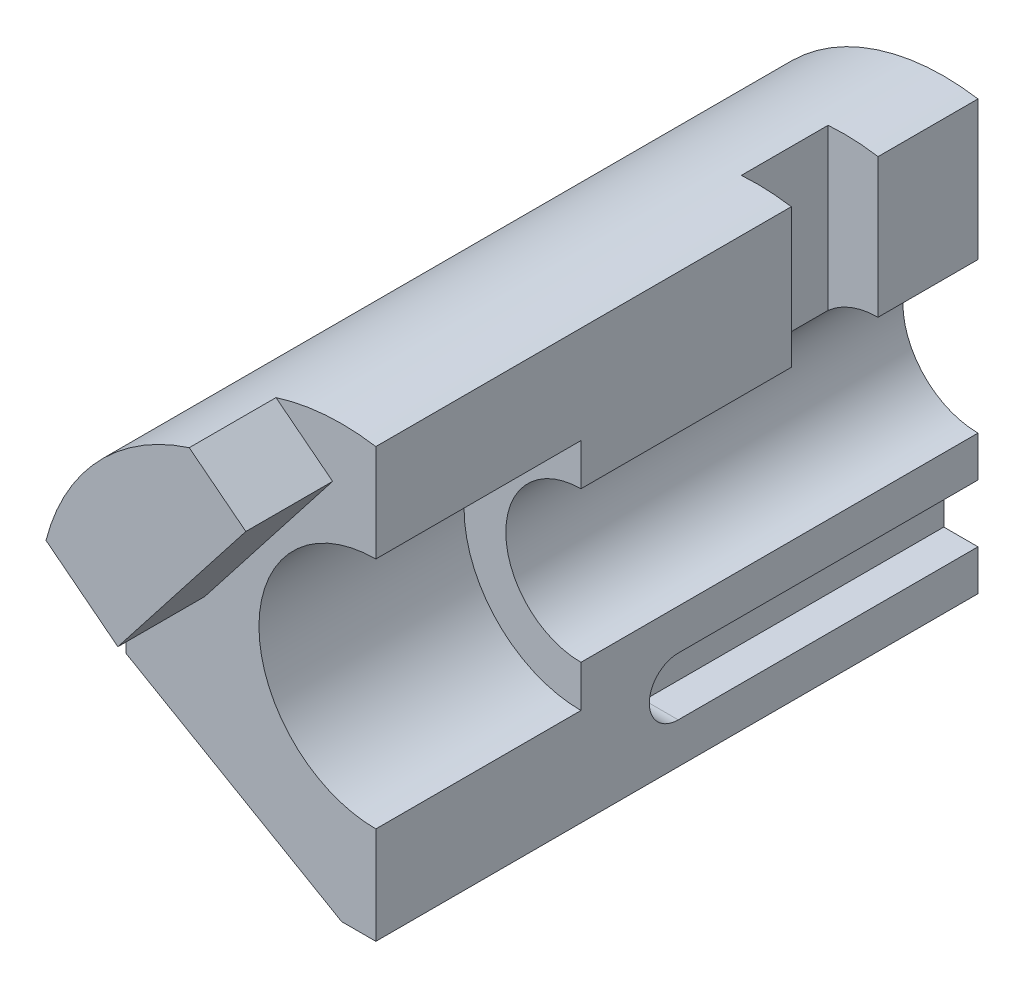
ISO-10303-21;
HEADER;
FILE_DESCRIPTION(('STEP AP214'),'2;1');
FILE_NAME('part.step','',(''),(''),'','','');
FILE_SCHEMA(('AUTOMOTIVE_DESIGN { 1 0 10303 214 1 1 1 1 }'));
ENDSEC;
DATA;
#1=APPLICATION_CONTEXT('core data for automotive mechanical design processes');
#2=APPLICATION_PROTOCOL_DEFINITION('international standard','automotive_design',2000,#1);
#3=PRODUCT_CONTEXT('',#1,'mechanical');
#4=PRODUCT('Part','Part','',(#3));
#5=PRODUCT_RELATED_PRODUCT_CATEGORY('part','',(#4));
#6=PRODUCT_DEFINITION_FORMATION('','',#4);
#7=PRODUCT_DEFINITION_CONTEXT('part definition',#1,'design');
#8=PRODUCT_DEFINITION('design','',#6,#7);
#9=PRODUCT_DEFINITION_SHAPE('','',#8);
#10=(LENGTH_UNIT() NAMED_UNIT(*) SI_UNIT(.MILLI.,.METRE.));
#11=(NAMED_UNIT(*) PLANE_ANGLE_UNIT() SI_UNIT($,.RADIAN.));
#12=(NAMED_UNIT(*) SI_UNIT($,.STERADIAN.) SOLID_ANGLE_UNIT());
#13=UNCERTAINTY_MEASURE_WITH_UNIT(LENGTH_MEASURE(1.E-05),#10,'distance_accuracy_value','');
#14=(GEOMETRIC_REPRESENTATION_CONTEXT(3) GLOBAL_UNCERTAINTY_ASSIGNED_CONTEXT((#13)) GLOBAL_UNIT_ASSIGNED_CONTEXT((#10,
#11,#12)) REPRESENTATION_CONTEXT('',''));
#15=CARTESIAN_POINT('',(0.,0.,0.));
#16=DIRECTION('',(0.,0.,1.));
#17=DIRECTION('',(1.,0.,0.));
#18=AXIS2_PLACEMENT_3D('',#15,#16,#17);
#19=CARTESIAN_POINT('',(0.,162.962954491545,229.));
#20=DIRECTION('',(-1.,0.,0.));
#21=DIRECTION('',(0.,-1.,0.));
#22=AXIS2_PLACEMENT_3D('',#19,#20,#21);
#23=PLANE('',#22);
#24=DIRECTION('',(0.,0.,1.));
#25=VECTOR('',#24,1.);
#26=CARTESIAN_POINT('',(0.,110.056477245773,0.));
#27=LINE('',#26,#25);
#28=CARTESIAN_POINT('',(0.,110.056477245773,151.));
#29=VERTEX_POINT('',#28);
#30=CARTESIAN_POINT('',(0.,110.056477245773,71.));
#31=VERTEX_POINT('',#30);
#32=EDGE_CURVE('E270',#29,#31,#27,.F.);
#33=ORIENTED_EDGE('',*,*,#32,.T.);
#34=DIRECTION('',(0.,1.,0.));
#35=VECTOR('',#34,1.);
#36=CARTESIAN_POINT('',(0.,-0.001000000000001,71.));
#37=LINE('',#36,#35);
#38=CARTESIAN_POINT('',(0.,162.962954491545,71.));
#39=VERTEX_POINT('',#38);
#40=EDGE_CURVE('E194',#31,#39,#37,.T.);
#41=ORIENTED_EDGE('',*,*,#40,.T.);
#42=DIRECTION('',(0.,0.,-1.));
#43=VECTOR('',#42,1.);
#44=CARTESIAN_POINT('',(0.,162.962954491545,229.));
#45=LINE('',#44,#43);
#46=CARTESIAN_POINT('',(0.,162.962954491545,229.));
#47=VERTEX_POINT('',#46);
#48=EDGE_CURVE('E326',#47,#39,#45,.T.);
#49=ORIENTED_EDGE('',*,*,#48,.F.);
#50=DIRECTION('',(0.,1.,0.));
#51=VECTOR('',#50,1.);
#52=CARTESIAN_POINT('',(0.,162.962954491545,229.));
#53=LINE('',#52,#51);
#54=CARTESIAN_POINT('',(0.,125.931477245773,229.));
#55=VERTEX_POINT('',#54);
#56=EDGE_CURVE('E292',#55,#47,#53,.T.);
#57=ORIENTED_EDGE('',*,*,#56,.F.);
#58=DIRECTION('',(0.,0.,1.));
#59=VECTOR('',#58,1.);
#60=CARTESIAN_POINT('',(0.,125.931477245773,151.));
#61=LINE('',#60,#59);
#62=CARTESIAN_POINT('',(0.,125.931477245773,151.));
#63=VERTEX_POINT('',#62);
#64=EDGE_CURVE('E280',#55,#63,#61,.F.);
#65=ORIENTED_EDGE('',*,*,#64,.T.);
#66=DIRECTION('',(0.,1.,0.));
#67=VECTOR('',#66,1.);
#68=CARTESIAN_POINT('',(0.,162.962954491545,151.));
#69=LINE('',#68,#67);
#70=EDGE_CURVE('E328',#29,#63,#69,.T.);
#71=ORIENTED_EDGE('',*,*,#70,.F.);
#72=EDGE_LOOP('',(#33,#41,#49,#57,#65,#71));
#73=FACE_BOUND('',#72,.T.);
#74=ADVANCED_FACE('F39',(#73),#23,.F.);
#75=CARTESIAN_POINT('',(-13.,82.,229.));
#76=DIRECTION('',(0.,0.,-1.));
#77=DIRECTION('',(-1.,0.,0.));
#78=AXIS2_PLACEMENT_3D('',#75,#76,#77);
#79=PLANE('',#78);
#80=DIRECTION('',(-0.78801075360672,0.61566147532566,0.));
#81=VECTOR('',#80,1.);
#82=CARTESIAN_POINT('',(-37.9723097416113,160.104953403539,229.));
#83=LINE('',#82,#81);
#84=CARTESIAN_POINT('',(-16.4375252778327,143.280135832069,229.));
#85=VERTEX_POINT('',#84);
#86=CARTESIAN_POINT('',(-37.9723097416113,160.104953403539,229.));
#87=VERTEX_POINT('',#86);
#88=EDGE_CURVE('E62',#85,#87,#83,.T.);
#89=ORIENTED_EDGE('',*,*,#88,.F.);
#90=DIRECTION('',(0.615661475325654,0.788010753606725,0.));
#91=VECTOR('',#90,1.);
#92=CARTESIAN_POINT('',(-16.4375252778327,143.280135832069,229.));
#93=LINE('',#92,#91);
#94=CARTESIAN_POINT('',(-65.1085584581536,80.9840541827246,229.));
#95=VERTEX_POINT('',#94);
#96=EDGE_CURVE('E226',#95,#85,#93,.T.);
#97=ORIENTED_EDGE('',*,*,#96,.F.);
#98=DIRECTION('',(0.788010753606725,-0.615661475325654,0.));
#99=VECTOR('',#98,1.);
#100=CARTESIAN_POINT('',(-65.1085584581536,80.9840541827246,229.));
#101=LINE('',#100,#99);
#102=CARTESIAN_POINT('',(-92.4382360039027,102.336338426282,229.));
#103=VERTEX_POINT('',#102);
#104=EDGE_CURVE('E213',#103,#95,#101,.T.);
#105=ORIENTED_EDGE('',*,*,#104,.F.);
#106=CARTESIAN_POINT('',(-13.,82.,229.));
#107=DIRECTION('',(0.,0.,1.));
#108=DIRECTION('',(-1.,0.,0.));
#109=AXIS2_PLACEMENT_3D('',#106,#107,#108);
#110=CIRCLE('',#109,82.);
#111=CARTESIAN_POINT('',(-95.,82.,229.));
#112=VERTEX_POINT('',#111);
#113=EDGE_CURVE('E291',#103,#112,#110,.T.);
#114=ORIENTED_EDGE('',*,*,#113,.T.);
#115=DIRECTION('',(0.,-1.,0.));
#116=VECTOR('',#115,1.);
#117=CARTESIAN_POINT('',(-95.,47.3427220735495,229.));
#118=LINE('',#117,#116);
#119=CARTESIAN_POINT('',(-95.,47.3427220735495,229.));
#120=VERTEX_POINT('',#119);
#121=EDGE_CURVE('E295',#112,#120,#118,.T.);
#122=ORIENTED_EDGE('',*,*,#121,.T.);
#123=DIRECTION('',(0.866025403784438,-0.500000000000001,0.));
#124=VECTOR('',#123,1.);
#125=CARTESIAN_POINT('',(-13.,0.,229.));
#126=LINE('',#125,#124);
#127=CARTESIAN_POINT('',(-13.,0.,229.));
#128=VERTEX_POINT('',#127);
#129=EDGE_CURVE('E297',#120,#128,#126,.T.);
#130=ORIENTED_EDGE('',*,*,#129,.T.);
#131=DIRECTION('',(1.,0.,0.));
#132=VECTOR('',#131,1.);
#133=CARTESIAN_POINT('',(0.,0.,229.));
#134=LINE('',#133,#132);
#135=CARTESIAN_POINT('',(0.,0.,229.));
#136=VERTEX_POINT('',#135);
#137=EDGE_CURVE('E299',#128,#136,#134,.T.);
#138=ORIENTED_EDGE('',*,*,#137,.T.);
#139=CARTESIAN_POINT('',(0.,37.0314772457726,229.));
#140=VERTEX_POINT('',#139);
#141=EDGE_CURVE('E288',#136,#140,#53,.T.);
#142=ORIENTED_EDGE('',*,*,#141,.T.);
#143=CARTESIAN_POINT('',(0.,81.4814772457726,229.));
#144=DIRECTION('',(0.,0.,1.));
#145=DIRECTION('',(1.,0.,0.));
#146=AXIS2_PLACEMENT_3D('',#143,#144,#145);
#147=CIRCLE('',#146,44.45);
#148=EDGE_CURVE('E276',#55,#140,#147,.T.);
#149=ORIENTED_EDGE('',*,*,#148,.F.);
#150=ORIENTED_EDGE('',*,*,#56,.T.);
#151=EDGE_CURVE('E293',#47,#87,#110,.T.);
#152=ORIENTED_EDGE('',*,*,#151,.T.);
#153=EDGE_LOOP('',(#89,#97,#105,#114,#122,#130,#138,#142,#149,#150,#152));
#154=FACE_BOUND('',#153,.T.);
#155=ADVANCED_FACE('F344',(#154),#79,.F.);
#156=DIRECTION('',(0.,1.,0.));
#157=VECTOR('',#156,1.);
#158=CARTESIAN_POINT('',(0.,162.962954491545,0.));
#159=LINE('',#158,#157);
#160=CARTESIAN_POINT('',(0.,0.,0.));
#161=VERTEX_POINT('',#160);
#162=CARTESIAN_POINT('',(0.,15.4532386228863,0.));
#163=VERTEX_POINT('',#162);
#164=EDGE_CURVE('E302',#161,#163,#159,.T.);
#165=ORIENTED_EDGE('',*,*,#164,.T.);
#166=DIRECTION('',(0.,0.,-1.));
#167=VECTOR('',#166,1.);
#168=CARTESIAN_POINT('',(0.,15.4532386228863,0.));
#169=LINE('',#168,#167);
#170=CARTESIAN_POINT('',(0.,15.4532386228863,114.));
#171=VERTEX_POINT('',#170);
#172=EDGE_CURVE('E245',#171,#163,#169,.T.);
#173=ORIENTED_EDGE('',*,*,#172,.F.);
#174=CARTESIAN_POINT('',(0.,26.4532386228863,114.));
#175=DIRECTION('',(1.,0.,0.));
#176=DIRECTION('',(0.,1.,0.));
#177=AXIS2_PLACEMENT_3D('',#174,#175,#176);
#178=CIRCLE('',#177,11.);
#179=CARTESIAN_POINT('',(0.,37.4532386228863,114.));
#180=VERTEX_POINT('',#179);
#181=EDGE_CURVE('E253',#180,#171,#178,.T.);
#182=ORIENTED_EDGE('',*,*,#181,.F.);
#183=DIRECTION('',(0.,0.,1.));
#184=VECTOR('',#183,1.);
#185=CARTESIAN_POINT('',(0.,37.4532386228863,0.));
#186=LINE('',#185,#184);
#187=CARTESIAN_POINT('',(0.,37.4532386228863,0.));
#188=VERTEX_POINT('',#187);
#189=EDGE_CURVE('E240',#188,#180,#186,.T.);
#190=ORIENTED_EDGE('',*,*,#189,.F.);
#191=CARTESIAN_POINT('',(0.,52.9064772457726,0.));
#192=VERTEX_POINT('',#191);
#193=EDGE_CURVE('E306',#188,#192,#159,.T.);
#194=ORIENTED_EDGE('',*,*,#193,.T.);
#195=DIRECTION('',(0.,0.,1.));
#196=VECTOR('',#195,1.);
#197=CARTESIAN_POINT('',(0.,52.9064772457726,0.));
#198=LINE('',#197,#196);
#199=CARTESIAN_POINT('',(0.,52.9064772457726,151.));
#200=VERTEX_POINT('',#199);
#201=EDGE_CURVE('E273',#192,#200,#198,.T.);
#202=ORIENTED_EDGE('',*,*,#201,.T.);
#203=CARTESIAN_POINT('',(0.,37.0314772457726,151.));
#204=VERTEX_POINT('',#203);
#205=EDGE_CURVE('E47',#204,#200,#69,.T.);
#206=ORIENTED_EDGE('',*,*,#205,.F.);
#207=DIRECTION('',(0.,0.,1.));
#208=VECTOR('',#207,1.);
#209=CARTESIAN_POINT('',(0.,37.0314772457726,151.));
#210=LINE('',#209,#208);
#211=EDGE_CURVE('E284',#204,#140,#210,.T.);
#212=ORIENTED_EDGE('',*,*,#211,.T.);
#213=ORIENTED_EDGE('',*,*,#141,.F.);
#214=DIRECTION('',(0.,0.,-1.));
#215=VECTOR('',#214,1.);
#216=CARTESIAN_POINT('',(0.,0.,229.));
#217=LINE('',#216,#215);
#218=EDGE_CURVE('E301',#136,#161,#217,.T.);
#219=ORIENTED_EDGE('',*,*,#218,.T.);
#220=EDGE_LOOP('',(#165,#173,#182,#190,#194,#202,#206,#212,#213,#219));
#221=FACE_BOUND('',#220,.T.);
#222=ADVANCED_FACE('F379',(#221),#23,.F.);
#223=CARTESIAN_POINT('',(0.,162.962954491545,38.));
#224=VERTEX_POINT('',#223);
#225=CARTESIAN_POINT('',(0.,162.962954491545,0.));
#226=VERTEX_POINT('',#225);
#227=EDGE_CURVE('E325',#224,#226,#45,.T.);
#228=ORIENTED_EDGE('',*,*,#227,.F.);
#229=DIRECTION('',(0.,1.,0.));
#230=VECTOR('',#229,1.);
#231=CARTESIAN_POINT('',(0.,-0.001000000000001,38.));
#232=LINE('',#231,#230);
#233=CARTESIAN_POINT('',(0.,110.056477245773,38.));
#234=VERTEX_POINT('',#233);
#235=EDGE_CURVE('E392',#234,#224,#232,.T.);
#236=ORIENTED_EDGE('',*,*,#235,.F.);
#237=CARTESIAN_POINT('',(0.,110.056477245773,0.));
#238=VERTEX_POINT('',#237);
#239=EDGE_CURVE('E204',#234,#238,#27,.F.);
#240=ORIENTED_EDGE('',*,*,#239,.T.);
#241=EDGE_CURVE('E287',#238,#226,#159,.T.);
#242=ORIENTED_EDGE('',*,*,#241,.T.);
#243=EDGE_LOOP('',(#228,#236,#240,#242));
#244=FACE_BOUND('',#243,.T.);
#245=ADVANCED_FACE('F41',(#244),#23,.F.);
#246=CARTESIAN_POINT('',(-13.,82.,229.));
#247=DIRECTION('',(0.,0.,-1.));
#248=DIRECTION('',(-1.,0.,0.));
#249=AXIS2_PLACEMENT_3D('',#246,#247,#248);
#250=CYLINDRICAL_SURFACE('',#249,82.);
#251=ORIENTED_EDGE('',*,*,#48,.T.);
#252=CARTESIAN_POINT('',(-13.,82.,71.));
#253=DIRECTION('',(0.,0.,1.));
#254=DIRECTION('',(1.,0.,0.));
#255=AXIS2_PLACEMENT_3D('',#252,#253,#254);
#256=CIRCLE('',#255,82.);
#257=CARTESIAN_POINT('',(-19.,163.780193201044,71.));
#258=VERTEX_POINT('',#257);
#259=EDGE_CURVE('E211',#39,#258,#256,.T.);
#260=ORIENTED_EDGE('',*,*,#259,.T.);
#261=DIRECTION('',(0.,0.,-1.));
#262=VECTOR('',#261,1.);
#263=CARTESIAN_POINT('',(-19.,163.780193201044,229.));
#264=LINE('',#263,#262);
#265=CARTESIAN_POINT('',(-19.,163.780193201044,38.));
#266=VERTEX_POINT('',#265);
#267=EDGE_CURVE('E205',#258,#266,#264,.T.);
#268=ORIENTED_EDGE('',*,*,#267,.T.);
#269=CARTESIAN_POINT('',(-13.,82.,38.));
#270=DIRECTION('',(0.,0.,-1.));
#271=DIRECTION('',(-1.,0.,0.));
#272=AXIS2_PLACEMENT_3D('',#269,#270,#271);
#273=CIRCLE('',#272,82.);
#274=EDGE_CURVE('E189',#266,#224,#273,.T.);
#275=ORIENTED_EDGE('',*,*,#274,.T.);
#276=ORIENTED_EDGE('',*,*,#227,.T.);
#277=CARTESIAN_POINT('',(-13.,82.,0.));
#278=DIRECTION('',(0.,0.,1.));
#279=DIRECTION('',(-1.,0.,0.));
#280=AXIS2_PLACEMENT_3D('',#277,#278,#279);
#281=CIRCLE('',#280,82.);
#282=CARTESIAN_POINT('',(-95.,82.,0.));
#283=VERTEX_POINT('',#282);
#284=EDGE_CURVE('E305',#226,#283,#281,.T.);
#285=ORIENTED_EDGE('',*,*,#284,.T.);
#286=DIRECTION('',(0.,0.,-1.));
#287=VECTOR('',#286,1.);
#288=CARTESIAN_POINT('',(-95.,82.,229.));
#289=LINE('',#288,#287);
#290=EDGE_CURVE('E322',#112,#283,#289,.T.);
#291=ORIENTED_EDGE('',*,*,#290,.F.);
#292=ORIENTED_EDGE('',*,*,#113,.F.);
#293=DIRECTION('',(0.,0.,-1.));
#294=VECTOR('',#293,1.);
#295=CARTESIAN_POINT('',(-92.4382360039027,102.336338426282,262.));
#296=LINE('',#295,#294);
#297=CARTESIAN_POINT('',(-92.4382360039027,102.336338426282,262.));
#298=VERTEX_POINT('',#297);
#299=EDGE_CURVE('E237',#298,#103,#296,.T.);
#300=ORIENTED_EDGE('',*,*,#299,.F.);
#301=CARTESIAN_POINT('',(-13.,82.,262.));
#302=DIRECTION('',(0.,0.,1.));
#303=DIRECTION('',(1.,0.,0.));
#304=AXIS2_PLACEMENT_3D('',#301,#302,#303);
#305=CIRCLE('',#304,82.);
#306=CARTESIAN_POINT('',(-37.9723097416113,160.104953403539,262.));
#307=VERTEX_POINT('',#306);
#308=EDGE_CURVE('E214',#307,#298,#305,.T.);
#309=ORIENTED_EDGE('',*,*,#308,.F.);
#310=DIRECTION('',(0.,0.,-1.));
#311=VECTOR('',#310,1.);
#312=CARTESIAN_POINT('',(-37.9723097416113,160.104953403539,262.));
#313=LINE('',#312,#311);
#314=EDGE_CURVE('E223',#307,#87,#313,.T.);
#315=ORIENTED_EDGE('',*,*,#314,.T.);
#316=ORIENTED_EDGE('',*,*,#151,.F.);
#317=EDGE_LOOP('',(#251,#260,#268,#275,#276,#285,#291,#292,#300,#309,#315,#316));
#318=FACE_BOUND('',#317,.T.);
#319=ADVANCED_FACE('F346',(#318),#250,.T.);
#320=CARTESIAN_POINT('',(-95.,47.3427220735495,229.));
#321=DIRECTION('',(1.,0.,0.));
#322=DIRECTION('',(0.,0.,-1.));
#323=AXIS2_PLACEMENT_3D('',#320,#321,#322);
#324=PLANE('',#323);
#325=DIRECTION('',(0.,-1.,0.));
#326=VECTOR('',#325,1.);
#327=CARTESIAN_POINT('',(-95.,47.3427220735495,0.));
#328=LINE('',#327,#326);
#329=CARTESIAN_POINT('',(-95.,47.3427220735495,0.));
#330=VERTEX_POINT('',#329);
#331=EDGE_CURVE('E308',#283,#330,#328,.T.);
#332=ORIENTED_EDGE('',*,*,#331,.T.);
#333=DIRECTION('',(0.,0.,-1.));
#334=VECTOR('',#333,1.);
#335=CARTESIAN_POINT('',(-95.,47.3427220735495,229.));
#336=LINE('',#335,#334);
#337=EDGE_CURVE('E319',#120,#330,#336,.T.);
#338=ORIENTED_EDGE('',*,*,#337,.F.);
#339=ORIENTED_EDGE('',*,*,#121,.F.);
#340=ORIENTED_EDGE('',*,*,#290,.T.);
#341=EDGE_LOOP('',(#332,#338,#339,#340));
#342=FACE_BOUND('',#341,.T.);
#343=ADVANCED_FACE('F367',(#342),#324,.F.);
#344=CARTESIAN_POINT('',(-13.,0.,229.));
#345=DIRECTION('',(0.500000000000001,0.866025403784438,0.));
#346=DIRECTION('',(-0.866025403784438,0.500000000000001,0.));
#347=AXIS2_PLACEMENT_3D('',#344,#345,#346);
#348=PLANE('',#347);
#349=DIRECTION('',(0.866025403784438,-0.500000000000001,0.));
#350=VECTOR('',#349,1.);
#351=CARTESIAN_POINT('',(-13.,0.,0.));
#352=LINE('',#351,#350);
#353=CARTESIAN_POINT('',(-13.,0.,0.));
#354=VERTEX_POINT('',#353);
#355=EDGE_CURVE('E310',#330,#354,#352,.T.);
#356=ORIENTED_EDGE('',*,*,#355,.T.);
#357=DIRECTION('',(0.,0.,-1.));
#358=VECTOR('',#357,1.);
#359=CARTESIAN_POINT('',(-13.,0.,229.));
#360=LINE('',#359,#358);
#361=EDGE_CURVE('E316',#128,#354,#360,.T.);
#362=ORIENTED_EDGE('',*,*,#361,.F.);
#363=ORIENTED_EDGE('',*,*,#129,.F.);
#364=ORIENTED_EDGE('',*,*,#337,.T.);
#365=EDGE_LOOP('',(#356,#362,#363,#364));
#366=FACE_BOUND('',#365,.T.);
#367=ADVANCED_FACE('F371',(#366),#348,.F.);
#368=CARTESIAN_POINT('',(0.,0.,229.));
#369=DIRECTION('',(0.,1.,0.));
#370=DIRECTION('',(-1.,0.,0.));
#371=AXIS2_PLACEMENT_3D('',#368,#369,#370);
#372=PLANE('',#371);
#373=DIRECTION('',(1.,0.,0.));
#374=VECTOR('',#373,1.);
#375=CARTESIAN_POINT('',(0.,0.,0.));
#376=LINE('',#375,#374);
#377=EDGE_CURVE('E312',#354,#161,#376,.T.);
#378=ORIENTED_EDGE('',*,*,#377,.T.);
#379=ORIENTED_EDGE('',*,*,#218,.F.);
#380=ORIENTED_EDGE('',*,*,#137,.F.);
#381=ORIENTED_EDGE('',*,*,#361,.T.);
#382=EDGE_LOOP('',(#378,#379,#380,#381));
#383=FACE_BOUND('',#382,.T.);
#384=ADVANCED_FACE('F376',(#383),#372,.F.);
#385=CARTESIAN_POINT('',(-13.,82.,0.));
#386=DIRECTION('',(0.,0.,-1.));
#387=DIRECTION('',(-1.,0.,0.));
#388=AXIS2_PLACEMENT_3D('',#385,#386,#387);
#389=PLANE('',#388);
#390=DIRECTION('',(1.,0.,0.));
#391=VECTOR('',#390,1.);
#392=CARTESIAN_POINT('',(-13.,15.4532386228863,0.));
#393=LINE('',#392,#391);
#394=CARTESIAN_POINT('',(-13.,15.4532386228863,0.));
#395=VERTEX_POINT('',#394);
#396=EDGE_CURVE('E257',#395,#163,#393,.T.);
#397=ORIENTED_EDGE('',*,*,#396,.T.);
#398=ORIENTED_EDGE('',*,*,#164,.F.);
#399=ORIENTED_EDGE('',*,*,#377,.F.);
#400=ORIENTED_EDGE('',*,*,#355,.F.);
#401=ORIENTED_EDGE('',*,*,#331,.F.);
#402=ORIENTED_EDGE('',*,*,#284,.F.);
#403=ORIENTED_EDGE('',*,*,#241,.F.);
#404=CARTESIAN_POINT('',(0.,81.4814772457726,0.));
#405=DIRECTION('',(0.,0.,1.));
#406=DIRECTION('',(1.,0.,0.));
#407=AXIS2_PLACEMENT_3D('',#404,#405,#406);
#408=CIRCLE('',#407,28.575);
#409=EDGE_CURVE('E266',#238,#192,#408,.T.);
#410=ORIENTED_EDGE('',*,*,#409,.T.);
#411=ORIENTED_EDGE('',*,*,#193,.F.);
#412=DIRECTION('',(1.,0.,0.));
#413=VECTOR('',#412,1.);
#414=CARTESIAN_POINT('',(-13.,37.4532386228863,0.));
#415=LINE('',#414,#413);
#416=CARTESIAN_POINT('',(-13.,37.4532386228863,0.));
#417=VERTEX_POINT('',#416);
#418=EDGE_CURVE('E250',#417,#188,#415,.T.);
#419=ORIENTED_EDGE('',*,*,#418,.F.);
#420=DIRECTION('',(0.,-1.,0.));
#421=VECTOR('',#420,1.);
#422=CARTESIAN_POINT('',(-13.,82.,0.));
#423=LINE('',#422,#421);
#424=EDGE_CURVE('E11',#417,#395,#423,.T.);
#425=ORIENTED_EDGE('',*,*,#424,.T.);
#426=EDGE_LOOP('',(#397,#398,#399,#400,#401,#402,#403,#410,#411,#419,#425));
#427=FACE_BOUND('',#426,.T.);
#428=ADVANCED_FACE('F386',(#427),#389,.T.);
#429=CARTESIAN_POINT('',(0.,81.4814772457726,151.));
#430=DIRECTION('',(0.,0.,1.));
#431=DIRECTION('',(1.,0.,0.));
#432=AXIS2_PLACEMENT_3D('',#429,#430,#431);
#433=PLANE('',#432);
#434=CARTESIAN_POINT('',(0.,81.4814772457726,151.));
#435=DIRECTION('',(0.,0.,1.));
#436=DIRECTION('',(1.,0.,0.));
#437=AXIS2_PLACEMENT_3D('',#434,#435,#436);
#438=CIRCLE('',#437,28.575);
#439=EDGE_CURVE('E260',#29,#200,#438,.T.);
#440=ORIENTED_EDGE('',*,*,#439,.F.);
#441=ORIENTED_EDGE('',*,*,#70,.T.);
#442=CARTESIAN_POINT('',(0.,81.4814772457726,151.));
#443=DIRECTION('',(0.,0.,1.));
#444=DIRECTION('',(1.,0.,0.));
#445=AXIS2_PLACEMENT_3D('',#442,#443,#444);
#446=CIRCLE('',#445,44.45);
#447=EDGE_CURVE('E277',#63,#204,#446,.T.);
#448=ORIENTED_EDGE('',*,*,#447,.T.);
#449=ORIENTED_EDGE('',*,*,#205,.T.);
#450=EDGE_LOOP('',(#440,#441,#448,#449));
#451=FACE_BOUND('',#450,.T.);
#452=ADVANCED_FACE('F335',(#451),#433,.T.);
#453=CARTESIAN_POINT('',(0.,81.4814772457726,151.));
#454=DIRECTION('',(0.,0.,1.));
#455=DIRECTION('',(1.,0.,0.));
#456=AXIS2_PLACEMENT_3D('',#453,#454,#455);
#457=CYLINDRICAL_SURFACE('',#456,44.45);
#458=ORIENTED_EDGE('',*,*,#447,.F.);
#459=ORIENTED_EDGE('',*,*,#64,.F.);
#460=ORIENTED_EDGE('',*,*,#148,.T.);
#461=ORIENTED_EDGE('',*,*,#211,.F.);
#462=EDGE_LOOP('',(#458,#459,#460,#461));
#463=FACE_BOUND('',#462,.T.);
#464=ADVANCED_FACE('F338',(#463),#457,.F.);
#465=CARTESIAN_POINT('',(0.,81.4814772457726,0.));
#466=DIRECTION('',(0.,0.,1.));
#467=DIRECTION('',(1.,0.,0.));
#468=AXIS2_PLACEMENT_3D('',#465,#466,#467);
#469=CYLINDRICAL_SURFACE('',#468,28.575);
#470=DIRECTION('',(0.,0.,1.));
#471=VECTOR('',#470,1.);
#472=CARTESIAN_POINT('',(-19.,102.824640671095,0.));
#473=LINE('',#472,#471);
#474=CARTESIAN_POINT('',(-19.,102.824640671095,71.));
#475=VERTEX_POINT('',#474);
#476=CARTESIAN_POINT('',(-19.,102.824640671095,38.));
#477=VERTEX_POINT('',#476);
#478=EDGE_CURVE('E197',#475,#477,#473,.F.);
#479=ORIENTED_EDGE('',*,*,#478,.F.);
#480=CARTESIAN_POINT('',(0.,81.4814772457726,71.));
#481=DIRECTION('',(0.,0.,1.));
#482=DIRECTION('',(1.,0.,0.));
#483=AXIS2_PLACEMENT_3D('',#480,#481,#482);
#484=CIRCLE('',#483,28.575);
#485=EDGE_CURVE('E54',#31,#475,#484,.T.);
#486=ORIENTED_EDGE('',*,*,#485,.F.);
#487=ORIENTED_EDGE('',*,*,#32,.F.);
#488=ORIENTED_EDGE('',*,*,#439,.T.);
#489=ORIENTED_EDGE('',*,*,#201,.F.);
#490=ORIENTED_EDGE('',*,*,#409,.F.);
#491=ORIENTED_EDGE('',*,*,#239,.F.);
#492=CARTESIAN_POINT('',(0.,81.4814772457726,38.));
#493=DIRECTION('',(0.,0.,-1.));
#494=DIRECTION('',(-1.,0.,0.));
#495=AXIS2_PLACEMENT_3D('',#492,#493,#494);
#496=CIRCLE('',#495,28.575);
#497=EDGE_CURVE('E187',#477,#234,#496,.T.);
#498=ORIENTED_EDGE('',*,*,#497,.F.);
#499=EDGE_LOOP('',(#479,#486,#487,#488,#489,#490,#491,#498));
#500=FACE_BOUND('',#499,.T.);
#501=ADVANCED_FACE('F202',(#500),#469,.F.);
#502=CARTESIAN_POINT('',(-13.,15.4532386228863,0.));
#503=DIRECTION('',(0.,-1.,0.));
#504=DIRECTION('',(0.,0.,-1.));
#505=AXIS2_PLACEMENT_3D('',#502,#503,#504);
#506=PLANE('',#505);
#507=ORIENTED_EDGE('',*,*,#172,.T.);
#508=ORIENTED_EDGE('',*,*,#396,.F.);
#509=DIRECTION('',(0.,0.,-1.));
#510=VECTOR('',#509,1.);
#511=CARTESIAN_POINT('',(-13.,15.4532386228863,0.));
#512=LINE('',#511,#510);
#513=CARTESIAN_POINT('',(-13.,15.4532386228863,114.));
#514=VERTEX_POINT('',#513);
#515=EDGE_CURVE('E248',#514,#395,#512,.T.);
#516=ORIENTED_EDGE('',*,*,#515,.F.);
#517=DIRECTION('',(1.,0.,0.));
#518=VECTOR('',#517,1.);
#519=CARTESIAN_POINT('',(-13.,15.4532386228863,114.));
#520=LINE('',#519,#518);
#521=EDGE_CURVE('E261',#514,#171,#520,.T.);
#522=ORIENTED_EDGE('',*,*,#521,.T.);
#523=EDGE_LOOP('',(#507,#508,#516,#522));
#524=FACE_BOUND('',#523,.T.);
#525=ADVANCED_FACE('F401',(#524),#506,.F.);
#526=CARTESIAN_POINT('',(-13.,26.4532386228863,114.));
#527=DIRECTION('',(1.,0.,0.));
#528=DIRECTION('',(0.,1.,0.));
#529=AXIS2_PLACEMENT_3D('',#526,#527,#528);
#530=CYLINDRICAL_SURFACE('',#529,11.);
#531=ORIENTED_EDGE('',*,*,#181,.T.);
#532=ORIENTED_EDGE('',*,*,#521,.F.);
#533=CARTESIAN_POINT('',(-13.,26.4532386228863,114.));
#534=DIRECTION('',(1.,0.,0.));
#535=DIRECTION('',(0.,1.,0.));
#536=AXIS2_PLACEMENT_3D('',#533,#534,#535);
#537=CIRCLE('',#536,11.);
#538=CARTESIAN_POINT('',(-13.,37.4532386228863,114.));
#539=VERTEX_POINT('',#538);
#540=EDGE_CURVE('E244',#539,#514,#537,.T.);
#541=ORIENTED_EDGE('',*,*,#540,.F.);
#542=DIRECTION('',(1.,0.,0.));
#543=VECTOR('',#542,1.);
#544=CARTESIAN_POINT('',(-13.,37.4532386228863,114.));
#545=LINE('',#544,#543);
#546=EDGE_CURVE('E263',#539,#180,#545,.T.);
#547=ORIENTED_EDGE('',*,*,#546,.T.);
#548=EDGE_LOOP('',(#531,#532,#541,#547));
#549=FACE_BOUND('',#548,.T.);
#550=ADVANCED_FACE('F405',(#549),#530,.F.);
#551=CARTESIAN_POINT('',(-13.,37.4532386228863,0.));
#552=DIRECTION('',(0.,1.,0.));
#553=DIRECTION('',(0.,0.,1.));
#554=AXIS2_PLACEMENT_3D('',#551,#552,#553);
#555=PLANE('',#554);
#556=ORIENTED_EDGE('',*,*,#189,.T.);
#557=ORIENTED_EDGE('',*,*,#546,.F.);
#558=DIRECTION('',(0.,0.,1.));
#559=VECTOR('',#558,1.);
#560=CARTESIAN_POINT('',(-13.,37.4532386228863,0.));
#561=LINE('',#560,#559);
#562=EDGE_CURVE('E241',#417,#539,#561,.T.);
#563=ORIENTED_EDGE('',*,*,#562,.F.);
#564=ORIENTED_EDGE('',*,*,#418,.T.);
#565=EDGE_LOOP('',(#556,#557,#563,#564));
#566=FACE_BOUND('',#565,.T.);
#567=ADVANCED_FACE('F408',(#566),#555,.F.);
#568=CARTESIAN_POINT('',(-13.,26.4532386228863,0.));
#569=DIRECTION('',(1.,0.,0.));
#570=DIRECTION('',(0.,1.,0.));
#571=AXIS2_PLACEMENT_3D('',#568,#569,#570);
#572=PLANE('',#571);
#573=ORIENTED_EDGE('',*,*,#562,.T.);
#574=ORIENTED_EDGE('',*,*,#540,.T.);
#575=ORIENTED_EDGE('',*,*,#515,.T.);
#576=ORIENTED_EDGE('',*,*,#424,.F.);
#577=EDGE_LOOP('',(#573,#574,#575,#576));
#578=FACE_BOUND('',#577,.T.);
#579=ADVANCED_FACE('F410',(#578),#572,.T.);
#580=CARTESIAN_POINT('',(-65.1085584581536,80.9840541827246,262.));
#581=DIRECTION('',(0.615661475325654,0.788010753606725,0.));
#582=DIRECTION('',(-0.788010753606725,0.615661475325654,0.));
#583=AXIS2_PLACEMENT_3D('',#580,#581,#582);
#584=PLANE('',#583);
#585=ORIENTED_EDGE('',*,*,#104,.T.);
#586=DIRECTION('',(0.,0.,-1.));
#587=VECTOR('',#586,1.);
#588=CARTESIAN_POINT('',(-65.1085584581536,80.9840541827246,262.));
#589=LINE('',#588,#587);
#590=CARTESIAN_POINT('',(-65.1085584581536,80.9840541827246,262.));
#591=VERTEX_POINT('',#590);
#592=EDGE_CURVE('E234',#591,#95,#589,.T.);
#593=ORIENTED_EDGE('',*,*,#592,.F.);
#594=DIRECTION('',(0.788010753606725,-0.615661475325654,0.));
#595=VECTOR('',#594,1.);
#596=CARTESIAN_POINT('',(-65.1085584581536,80.9840541827246,262.));
#597=LINE('',#596,#595);
#598=EDGE_CURVE('E217',#298,#591,#597,.T.);
#599=ORIENTED_EDGE('',*,*,#598,.F.);
#600=ORIENTED_EDGE('',*,*,#299,.T.);
#601=EDGE_LOOP('',(#585,#593,#599,#600));
#602=FACE_BOUND('',#601,.T.);
#603=ADVANCED_FACE('F360',(#602),#584,.F.);
#604=CARTESIAN_POINT('',(-16.4375252778327,143.280135832069,262.));
#605=DIRECTION('',(-0.788010753606725,0.615661475325654,0.));
#606=DIRECTION('',(-0.615661475325654,-0.788010753606725,0.));
#607=AXIS2_PLACEMENT_3D('',#604,#605,#606);
#608=PLANE('',#607);
#609=ORIENTED_EDGE('',*,*,#96,.T.);
#610=DIRECTION('',(0.,0.,-1.));
#611=VECTOR('',#610,1.);
#612=CARTESIAN_POINT('',(-16.4375252778327,143.280135832069,262.));
#613=LINE('',#612,#611);
#614=CARTESIAN_POINT('',(-16.4375252778327,143.280135832069,262.));
#615=VERTEX_POINT('',#614);
#616=EDGE_CURVE('E231',#615,#85,#613,.T.);
#617=ORIENTED_EDGE('',*,*,#616,.F.);
#618=DIRECTION('',(0.615661475325654,0.788010753606725,0.));
#619=VECTOR('',#618,1.);
#620=CARTESIAN_POINT('',(-16.4375252778327,143.280135832069,262.));
#621=LINE('',#620,#619);
#622=EDGE_CURVE('E219',#591,#615,#621,.T.);
#623=ORIENTED_EDGE('',*,*,#622,.F.);
#624=ORIENTED_EDGE('',*,*,#592,.T.);
#625=EDGE_LOOP('',(#609,#617,#623,#624));
#626=FACE_BOUND('',#625,.T.);
#627=ADVANCED_FACE('F356',(#626),#608,.F.);
#628=CARTESIAN_POINT('',(-37.9723097416113,160.104953403539,262.));
#629=DIRECTION('',(-0.61566147532566,-0.78801075360672,0.));
#630=DIRECTION('',(0.788010753606721,-0.61566147532566,0.));
#631=AXIS2_PLACEMENT_3D('',#628,#629,#630);
#632=PLANE('',#631);
#633=ORIENTED_EDGE('',*,*,#88,.T.);
#634=ORIENTED_EDGE('',*,*,#314,.F.);
#635=DIRECTION('',(-0.78801075360672,0.61566147532566,0.));
#636=VECTOR('',#635,1.);
#637=CARTESIAN_POINT('',(-37.9723097416113,160.104953403539,262.));
#638=LINE('',#637,#636);
#639=EDGE_CURVE('E221',#615,#307,#638,.T.);
#640=ORIENTED_EDGE('',*,*,#639,.F.);
#641=ORIENTED_EDGE('',*,*,#616,.T.);
#642=EDGE_LOOP('',(#633,#634,#640,#641));
#643=FACE_BOUND('',#642,.T.);
#644=ADVANCED_FACE('F352',(#643),#632,.F.);
#645=CARTESIAN_POINT('',(-13.,82.,262.));
#646=DIRECTION('',(0.,0.,1.));
#647=DIRECTION('',(1.,0.,0.));
#648=AXIS2_PLACEMENT_3D('',#645,#646,#647);
#649=PLANE('',#648);
#650=ORIENTED_EDGE('',*,*,#308,.T.);
#651=ORIENTED_EDGE('',*,*,#598,.T.);
#652=ORIENTED_EDGE('',*,*,#622,.T.);
#653=ORIENTED_EDGE('',*,*,#639,.T.);
#654=EDGE_LOOP('',(#650,#651,#652,#653));
#655=FACE_BOUND('',#654,.T.);
#656=ADVANCED_FACE('F505',(#655),#649,.T.);
#657=CARTESIAN_POINT('',(0.,-0.001000000000001,71.));
#658=DIRECTION('',(0.,0.,1.));
#659=DIRECTION('',(1.,0.,0.));
#660=AXIS2_PLACEMENT_3D('',#657,#658,#659);
#661=PLANE('',#660);
#662=ORIENTED_EDGE('',*,*,#40,.F.);
#663=ORIENTED_EDGE('',*,*,#485,.T.);
#664=DIRECTION('',(0.,1.,0.));
#665=VECTOR('',#664,1.);
#666=CARTESIAN_POINT('',(-19.,-0.001000000000001,71.));
#667=LINE('',#666,#665);
#668=EDGE_CURVE('E193',#475,#258,#667,.T.);
#669=ORIENTED_EDGE('',*,*,#668,.T.);
#670=ORIENTED_EDGE('',*,*,#259,.F.);
#671=EDGE_LOOP('',(#662,#663,#669,#670));
#672=FACE_BOUND('',#671,.T.);
#673=ADVANCED_FACE('F396',(#672),#661,.F.);
#674=CARTESIAN_POINT('',(0.,-0.001000000000001,38.));
#675=DIRECTION('',(0.,0.,-1.));
#676=DIRECTION('',(-1.,0.,0.));
#677=AXIS2_PLACEMENT_3D('',#674,#675,#676);
#678=PLANE('',#677);
#679=DIRECTION('',(0.,1.,0.));
#680=VECTOR('',#679,1.);
#681=CARTESIAN_POINT('',(-19.,-0.001000000000001,38.));
#682=LINE('',#681,#680);
#683=EDGE_CURVE('E182',#477,#266,#682,.T.);
#684=ORIENTED_EDGE('',*,*,#683,.F.);
#685=ORIENTED_EDGE('',*,*,#497,.T.);
#686=ORIENTED_EDGE('',*,*,#235,.T.);
#687=ORIENTED_EDGE('',*,*,#274,.F.);
#688=EDGE_LOOP('',(#684,#685,#686,#687));
#689=FACE_BOUND('',#688,.T.);
#690=ADVANCED_FACE('F184',(#689),#678,.F.);
#691=CARTESIAN_POINT('',(-19.,-0.001000000000001,71.));
#692=DIRECTION('',(-1.,0.,0.));
#693=DIRECTION('',(0.,-1.,0.));
#694=AXIS2_PLACEMENT_3D('',#691,#692,#693);
#695=PLANE('',#694);
#696=ORIENTED_EDGE('',*,*,#668,.F.);
#697=ORIENTED_EDGE('',*,*,#478,.T.);
#698=ORIENTED_EDGE('',*,*,#683,.T.);
#699=ORIENTED_EDGE('',*,*,#267,.F.);
#700=EDGE_LOOP('',(#696,#697,#698,#699));
#701=FACE_BOUND('',#700,.T.);
#702=ADVANCED_FACE('F198',(#701),#695,.F.);
#703=CLOSED_SHELL('',(#74,#155,#222,#245,#319,#343,#367,#384,#428,#452,#464,#501,#525,#550,#567,
#579,#603,#627,#644,#656,#673,#690,#702));
#704=MANIFOLD_SOLID_BREP('B2',#703);
#705=ADVANCED_BREP_SHAPE_REPRESENTATION('',(#18,#704),#14);
#706=SHAPE_DEFINITION_REPRESENTATION(#9,#705);
ENDSEC;
END-ISO-10303-21;
